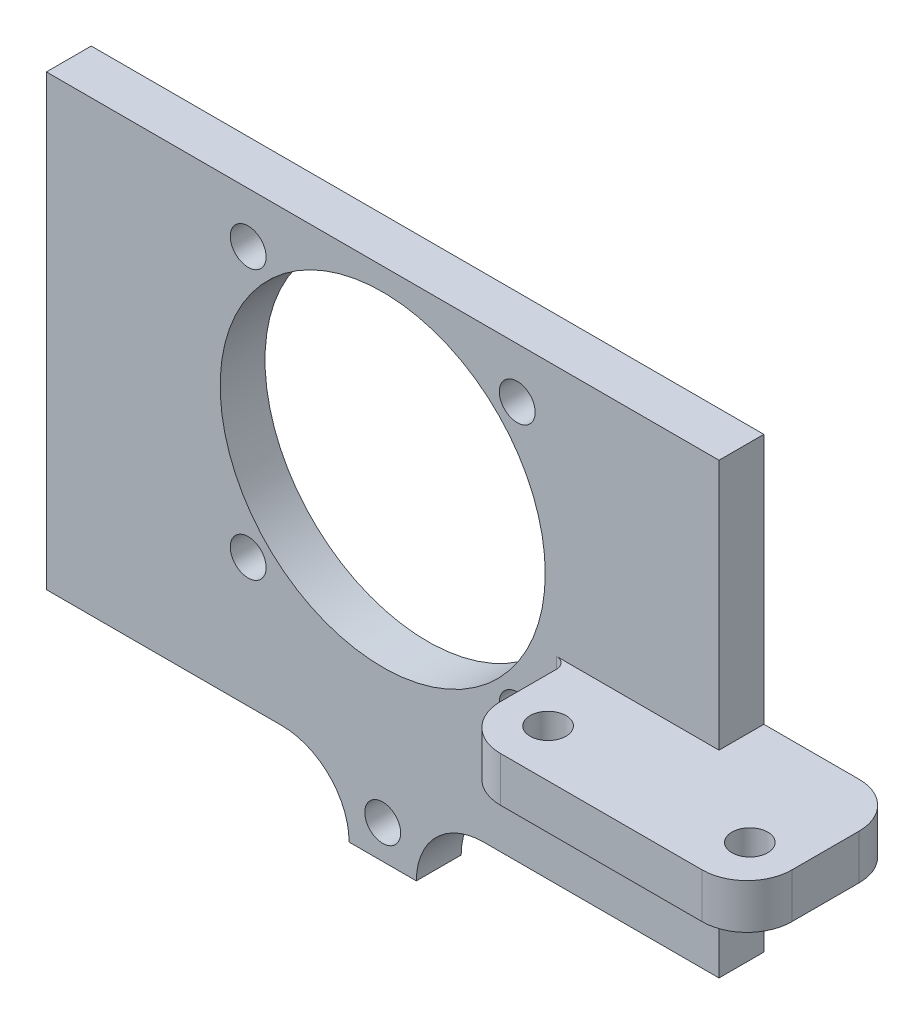
ISO-10303-21;
HEADER;
FILE_DESCRIPTION(('STEP AP214'),'2;1');
FILE_NAME('part.step','',(''),(''),'','','');
FILE_SCHEMA(('AUTOMOTIVE_DESIGN { 1 0 10303 214 1 1 1 1 }'));
ENDSEC;
DATA;
#1=APPLICATION_CONTEXT('core data for automotive mechanical design processes');
#2=APPLICATION_PROTOCOL_DEFINITION('international standard','automotive_design',2000,#1);
#3=PRODUCT_CONTEXT('',#1,'mechanical');
#4=PRODUCT('Part','Part','',(#3));
#5=PRODUCT_RELATED_PRODUCT_CATEGORY('part','',(#4));
#6=PRODUCT_DEFINITION_FORMATION('','',#4);
#7=PRODUCT_DEFINITION_CONTEXT('part definition',#1,'design');
#8=PRODUCT_DEFINITION('design','',#6,#7);
#9=PRODUCT_DEFINITION_SHAPE('','',#8);
#10=(LENGTH_UNIT() NAMED_UNIT(*) SI_UNIT(.MILLI.,.METRE.));
#11=(NAMED_UNIT(*) PLANE_ANGLE_UNIT() SI_UNIT($,.RADIAN.));
#12=(NAMED_UNIT(*) SI_UNIT($,.STERADIAN.) SOLID_ANGLE_UNIT());
#13=UNCERTAINTY_MEASURE_WITH_UNIT(LENGTH_MEASURE(1.E-05),#10,'distance_accuracy_value','');
#14=(GEOMETRIC_REPRESENTATION_CONTEXT(3) GLOBAL_UNCERTAINTY_ASSIGNED_CONTEXT((#13)) GLOBAL_UNIT_ASSIGNED_CONTEXT((#10,
#11,#12)) REPRESENTATION_CONTEXT('',''));
#15=CARTESIAN_POINT('',(0.,0.,0.));
#16=DIRECTION('',(0.,0.,1.));
#17=DIRECTION('',(1.,0.,0.));
#18=AXIS2_PLACEMENT_3D('',#15,#16,#17);
#19=CARTESIAN_POINT('',(0.,0.,4.));
#20=DIRECTION('',(0.,1.,0.));
#21=DIRECTION('',(0.,0.,1.));
#22=AXIS2_PLACEMENT_3D('',#19,#20,#21);
#23=PLANE('',#22);
#24=DIRECTION('',(1.,0.,0.));
#25=VECTOR('',#24,1.);
#26=CARTESIAN_POINT('',(0.,0.,4.));
#27=LINE('',#26,#25);
#28=CARTESIAN_POINT('',(39.,0.,4.));
#29=VERTEX_POINT('',#28);
#30=CARTESIAN_POINT('',(60.,0.,4.));
#31=VERTEX_POINT('',#30);
#32=EDGE_CURVE('E268',#29,#31,#27,.T.);
#33=ORIENTED_EDGE('',*,*,#32,.F.);
#34=DIRECTION('',(0.,0.,1.));
#35=VECTOR('',#34,1.);
#36=CARTESIAN_POINT('',(39.,0.,0.));
#37=LINE('',#36,#35);
#38=CARTESIAN_POINT('',(39.,0.,0.));
#39=VERTEX_POINT('',#38);
#40=EDGE_CURVE('E56',#29,#39,#37,.F.);
#41=ORIENTED_EDGE('',*,*,#40,.T.);
#42=DIRECTION('',(1.,0.,0.));
#43=VECTOR('',#42,1.);
#44=CARTESIAN_POINT('',(0.,0.,0.));
#45=LINE('',#44,#43);
#46=CARTESIAN_POINT('',(60.,0.,0.));
#47=VERTEX_POINT('',#46);
#48=EDGE_CURVE('E280',#39,#47,#45,.T.);
#49=ORIENTED_EDGE('',*,*,#48,.T.);
#50=DIRECTION('',(0.,0.,-1.));
#51=VECTOR('',#50,1.);
#52=CARTESIAN_POINT('',(60.,0.,4.));
#53=LINE('',#52,#51);
#54=EDGE_CURVE('E294',#31,#47,#53,.T.);
#55=ORIENTED_EDGE('',*,*,#54,.F.);
#56=EDGE_LOOP('',(#33,#41,#49,#55));
#57=FACE_BOUND('',#56,.T.);
#58=ADVANCED_FACE('F35',(#57),#23,.F.);
#59=CARTESIAN_POINT('',(0.,0.,0.));
#60=VERTEX_POINT('',#59);
#61=CARTESIAN_POINT('',(21.,0.,0.));
#62=VERTEX_POINT('',#61);
#63=EDGE_CURVE('E281',#60,#62,#45,.T.);
#64=ORIENTED_EDGE('',*,*,#63,.T.);
#65=DIRECTION('',(0.,0.,-1.));
#66=VECTOR('',#65,1.);
#67=CARTESIAN_POINT('',(21.,0.,4.));
#68=LINE('',#67,#66);
#69=CARTESIAN_POINT('',(21.,0.,4.));
#70=VERTEX_POINT('',#69);
#71=EDGE_CURVE('E343',#62,#70,#68,.F.);
#72=ORIENTED_EDGE('',*,*,#71,.T.);
#73=CARTESIAN_POINT('',(0.,0.,4.));
#74=VERTEX_POINT('',#73);
#75=EDGE_CURVE('E270',#74,#70,#27,.T.);
#76=ORIENTED_EDGE('',*,*,#75,.F.);
#77=DIRECTION('',(0.,0.,-1.));
#78=VECTOR('',#77,1.);
#79=CARTESIAN_POINT('',(0.,0.,4.));
#80=LINE('',#79,#78);
#81=EDGE_CURVE('E222',#74,#60,#80,.T.);
#82=ORIENTED_EDGE('',*,*,#81,.T.);
#83=EDGE_LOOP('',(#64,#72,#76,#82));
#84=FACE_BOUND('',#83,.T.);
#85=ADVANCED_FACE('F359',(#84),#23,.F.);
#86=CARTESIAN_POINT('',(60.,0.,4.));
#87=DIRECTION('',(-1.,0.,0.));
#88=DIRECTION('',(0.,0.,1.));
#89=AXIS2_PLACEMENT_3D('',#86,#87,#88);
#90=PLANE('',#89);
#91=DIRECTION('',(0.,1.,0.));
#92=VECTOR('',#91,1.);
#93=CARTESIAN_POINT('',(60.,0.,0.));
#94=LINE('',#93,#92);
#95=CARTESIAN_POINT('',(60.,12.5999999999763,0.));
#96=VERTEX_POINT('',#95);
#97=EDGE_CURVE('E285',#47,#96,#94,.T.);
#98=ORIENTED_EDGE('',*,*,#97,.T.);
#99=DIRECTION('',(0.,0.,-1.));
#100=VECTOR('',#99,1.);
#101=CARTESIAN_POINT('',(60.,12.5999999999763,4.));
#102=LINE('',#101,#100);
#103=CARTESIAN_POINT('',(60.,12.5999999999763,4.));
#104=VERTEX_POINT('',#103);
#105=EDGE_CURVE('E330',#96,#104,#102,.F.);
#106=ORIENTED_EDGE('',*,*,#105,.T.);
#107=DIRECTION('',(0.,1.,0.));
#108=VECTOR('',#107,1.);
#109=CARTESIAN_POINT('',(60.,0.,4.));
#110=LINE('',#109,#108);
#111=EDGE_CURVE('E273',#31,#104,#110,.T.);
#112=ORIENTED_EDGE('',*,*,#111,.F.);
#113=ORIENTED_EDGE('',*,*,#54,.T.);
#114=EDGE_LOOP('',(#98,#106,#112,#113));
#115=FACE_BOUND('',#114,.T.);
#116=ADVANCED_FACE('F376',(#115),#90,.F.);
#117=DIRECTION('',(0.,0.,1.));
#118=VECTOR('',#117,1.);
#119=CARTESIAN_POINT('',(60.,17.5999999999763,4.));
#120=LINE('',#119,#118);
#121=CARTESIAN_POINT('',(60.,17.5999999999763,0.));
#122=VERTEX_POINT('',#121);
#123=CARTESIAN_POINT('',(60.,17.5999999999763,4.));
#124=VERTEX_POINT('',#123);
#125=EDGE_CURVE('E192',#122,#124,#120,.T.);
#126=ORIENTED_EDGE('',*,*,#125,.F.);
#127=CARTESIAN_POINT('',(60.,40.,0.));
#128=VERTEX_POINT('',#127);
#129=EDGE_CURVE('E284',#122,#128,#94,.T.);
#130=ORIENTED_EDGE('',*,*,#129,.T.);
#131=DIRECTION('',(0.,0.,-1.));
#132=VECTOR('',#131,1.);
#133=CARTESIAN_POINT('',(60.,40.,4.));
#134=LINE('',#133,#132);
#135=CARTESIAN_POINT('',(60.,40.,4.));
#136=VERTEX_POINT('',#135);
#137=EDGE_CURVE('E291',#136,#128,#134,.T.);
#138=ORIENTED_EDGE('',*,*,#137,.F.);
#139=EDGE_CURVE('E272',#124,#136,#110,.T.);
#140=ORIENTED_EDGE('',*,*,#139,.F.);
#141=EDGE_LOOP('',(#126,#130,#138,#140));
#142=FACE_BOUND('',#141,.T.);
#143=ADVANCED_FACE('F443',(#142),#90,.F.);
#144=CARTESIAN_POINT('',(0.,0.,4.));
#145=DIRECTION('',(0.,0.,-1.));
#146=DIRECTION('',(-1.,0.,0.));
#147=AXIS2_PLACEMENT_3D('',#144,#145,#146);
#148=PLANE('',#147);
#149=CARTESIAN_POINT('',(30.,-3.,4.));
#150=DIRECTION('',(0.,0.,1.));
#151=DIRECTION('',(1.,0.,0.));
#152=AXIS2_PLACEMENT_3D('',#149,#150,#151);
#153=CIRCLE('',#152,1.6);
#154=CARTESIAN_POINT('',(31.6,-3.,4.));
#155=VERTEX_POINT('',#154);
#156=EDGE_CURVE('E185',#155,#155,#153,.T.);
#157=ORIENTED_EDGE('',*,*,#156,.F.);
#158=EDGE_LOOP('',(#157));
#159=FACE_BOUND('',#158,.T.);
#160=CARTESIAN_POINT('',(30.,23.5,4.));
#161=DIRECTION('',(0.,0.,1.));
#162=DIRECTION('',(1.,0.,0.));
#163=AXIS2_PLACEMENT_3D('',#160,#161,#162);
#164=CIRCLE('',#163,14.5);
#165=CARTESIAN_POINT('',(44.5,23.5,4.));
#166=VERTEX_POINT('',#165);
#167=EDGE_CURVE('E256',#166,#166,#164,.T.);
#168=ORIENTED_EDGE('',*,*,#167,.F.);
#169=EDGE_LOOP('',(#168));
#170=FACE_BOUND('',#169,.T.);
#171=CARTESIAN_POINT('',(42.0000000000001,11.4999999999967,4.));
#172=DIRECTION('',(0.,0.,1.));
#173=DIRECTION('',(1.,0.,0.));
#174=AXIS2_PLACEMENT_3D('',#171,#172,#173);
#175=CIRCLE('',#174,1.60000000000088);
#176=CARTESIAN_POINT('',(43.600000000001,11.4999999999967,4.));
#177=VERTEX_POINT('',#176);
#178=EDGE_CURVE('E238',#177,#177,#175,.T.);
#179=ORIENTED_EDGE('',*,*,#178,.F.);
#180=EDGE_LOOP('',(#179));
#181=FACE_BOUND('',#180,.T.);
#182=CARTESIAN_POINT('',(18.0000000000002,11.4999999999966,4.));
#183=DIRECTION('',(0.,0.,1.));
#184=DIRECTION('',(1.,0.,0.));
#185=AXIS2_PLACEMENT_3D('',#182,#183,#184);
#186=CIRCLE('',#185,1.60000000000088);
#187=CARTESIAN_POINT('',(19.6000000000011,11.4999999999966,4.));
#188=VERTEX_POINT('',#187);
#189=EDGE_CURVE('E239',#188,#188,#186,.T.);
#190=ORIENTED_EDGE('',*,*,#189,.F.);
#191=EDGE_LOOP('',(#190));
#192=FACE_BOUND('',#191,.T.);
#193=CARTESIAN_POINT('',(18.,35.4999999999966,4.));
#194=DIRECTION('',(0.,0.,1.));
#195=DIRECTION('',(1.,0.,0.));
#196=AXIS2_PLACEMENT_3D('',#193,#194,#195);
#197=CIRCLE('',#196,1.60000000000088);
#198=CARTESIAN_POINT('',(19.6000000000009,35.4999999999966,4.));
#199=VERTEX_POINT('',#198);
#200=EDGE_CURVE('E245',#199,#199,#197,.T.);
#201=ORIENTED_EDGE('',*,*,#200,.F.);
#202=EDGE_LOOP('',(#201));
#203=FACE_BOUND('',#202,.T.);
#204=CARTESIAN_POINT('',(42.0000000000001,35.4999999999967,4.));
#205=DIRECTION('',(0.,0.,1.));
#206=DIRECTION('',(1.,0.,0.));
#207=AXIS2_PLACEMENT_3D('',#204,#205,#206);
#208=CIRCLE('',#207,1.60000000000088);
#209=CARTESIAN_POINT('',(43.6000000000009,35.4999999999967,4.));
#210=VERTEX_POINT('',#209);
#211=EDGE_CURVE('E234',#210,#210,#208,.T.);
#212=ORIENTED_EDGE('',*,*,#211,.F.);
#213=EDGE_LOOP('',(#212));
#214=FACE_BOUND('',#213,.T.);
#215=ORIENTED_EDGE('',*,*,#111,.T.);
#216=DIRECTION('',(1.,0.,0.));
#217=VECTOR('',#216,1.);
#218=CARTESIAN_POINT('',(46.5000000000019,12.5999999999763,4.));
#219=LINE('',#218,#217);
#220=CARTESIAN_POINT('',(45.5000000000019,12.5999999999763,4.));
#221=VERTEX_POINT('',#220);
#222=EDGE_CURVE('E335',#104,#221,#219,.F.);
#223=ORIENTED_EDGE('',*,*,#222,.T.);
#224=DIRECTION('',(0.,-1.,0.));
#225=VECTOR('',#224,1.);
#226=CARTESIAN_POINT('',(45.5000000000019,17.5999999999763,4.));
#227=LINE('',#226,#225);
#228=CARTESIAN_POINT('',(45.5000000000019,17.5999999999763,4.));
#229=VERTEX_POINT('',#228);
#230=EDGE_CURVE('E332',#221,#229,#227,.F.);
#231=ORIENTED_EDGE('',*,*,#230,.T.);
#232=DIRECTION('',(-1.,0.,0.));
#233=VECTOR('',#232,1.);
#234=CARTESIAN_POINT('',(46.5000000000019,17.5999999999763,4.));
#235=LINE('',#234,#233);
#236=EDGE_CURVE('E219',#124,#229,#235,.T.);
#237=ORIENTED_EDGE('',*,*,#236,.F.);
#238=ORIENTED_EDGE('',*,*,#139,.T.);
#239=DIRECTION('',(-1.,0.,0.));
#240=VECTOR('',#239,1.);
#241=CARTESIAN_POINT('',(0.,40.,4.));
#242=LINE('',#241,#240);
#243=CARTESIAN_POINT('',(0.,40.,4.));
#244=VERTEX_POINT('',#243);
#245=EDGE_CURVE('E275',#136,#244,#242,.T.);
#246=ORIENTED_EDGE('',*,*,#245,.T.);
#247=DIRECTION('',(0.,-1.,0.));
#248=VECTOR('',#247,1.);
#249=CARTESIAN_POINT('',(0.,0.,4.));
#250=LINE('',#249,#248);
#251=EDGE_CURVE('E265',#244,#74,#250,.T.);
#252=ORIENTED_EDGE('',*,*,#251,.T.);
#253=ORIENTED_EDGE('',*,*,#75,.T.);
#254=CARTESIAN_POINT('',(21.,-6.,4.));
#255=DIRECTION('',(0.,0.,-1.));
#256=DIRECTION('',(-1.,0.,0.));
#257=AXIS2_PLACEMENT_3D('',#254,#255,#256);
#258=CIRCLE('',#257,6.);
#259=CARTESIAN_POINT('',(27.,-6.,4.));
#260=VERTEX_POINT('',#259);
#261=EDGE_CURVE('E166',#70,#260,#258,.T.);
#262=ORIENTED_EDGE('',*,*,#261,.T.);
#263=DIRECTION('',(-1.,0.,0.));
#264=VECTOR('',#263,1.);
#265=CARTESIAN_POINT('',(33.,-6.,4.));
#266=LINE('',#265,#264);
#267=CARTESIAN_POINT('',(33.,-6.,4.));
#268=VERTEX_POINT('',#267);
#269=EDGE_CURVE('E168',#268,#260,#266,.T.);
#270=ORIENTED_EDGE('',*,*,#269,.F.);
#271=CARTESIAN_POINT('',(39.,-6.,4.));
#272=DIRECTION('',(0.,0.,-1.));
#273=DIRECTION('',(-1.,0.,0.));
#274=AXIS2_PLACEMENT_3D('',#271,#272,#273);
#275=CIRCLE('',#274,6.);
#276=EDGE_CURVE('E43',#268,#29,#275,.T.);
#277=ORIENTED_EDGE('',*,*,#276,.T.);
#278=ORIENTED_EDGE('',*,*,#32,.T.);
#279=EDGE_LOOP('',(#215,#223,#231,#237,#238,#246,#252,#253,#262,#270,#277,#278));
#280=FACE_BOUND('',#279,.T.);
#281=ADVANCED_FACE('F170',(#159,#170,#181,#192,#203,#214,#280),#148,.F.);
#282=CARTESIAN_POINT('',(0.,0.,4.));
#283=DIRECTION('',(1.,0.,0.));
#284=DIRECTION('',(0.,0.,-1.));
#285=AXIS2_PLACEMENT_3D('',#282,#283,#284);
#286=PLANE('',#285);
#287=DIRECTION('',(0.,-1.,0.));
#288=VECTOR('',#287,1.);
#289=CARTESIAN_POINT('',(0.,0.,0.));
#290=LINE('',#289,#288);
#291=CARTESIAN_POINT('',(0.,40.,0.));
#292=VERTEX_POINT('',#291);
#293=EDGE_CURVE('E262',#292,#60,#290,.T.);
#294=ORIENTED_EDGE('',*,*,#293,.T.);
#295=ORIENTED_EDGE('',*,*,#81,.F.);
#296=ORIENTED_EDGE('',*,*,#251,.F.);
#297=DIRECTION('',(0.,0.,-1.));
#298=VECTOR('',#297,1.);
#299=CARTESIAN_POINT('',(0.,40.,4.));
#300=LINE('',#299,#298);
#301=EDGE_CURVE('E277',#244,#292,#300,.T.);
#302=ORIENTED_EDGE('',*,*,#301,.T.);
#303=EDGE_LOOP('',(#294,#295,#296,#302));
#304=FACE_BOUND('',#303,.T.);
#305=ADVANCED_FACE('F380',(#304),#286,.F.);
#306=CARTESIAN_POINT('',(0.,40.,4.));
#307=DIRECTION('',(0.,-1.,0.));
#308=DIRECTION('',(0.,0.,-1.));
#309=AXIS2_PLACEMENT_3D('',#306,#307,#308);
#310=PLANE('',#309);
#311=DIRECTION('',(-1.,0.,0.));
#312=VECTOR('',#311,1.);
#313=CARTESIAN_POINT('',(0.,40.,0.));
#314=LINE('',#313,#312);
#315=EDGE_CURVE('E269',#128,#292,#314,.T.);
#316=ORIENTED_EDGE('',*,*,#315,.T.);
#317=ORIENTED_EDGE('',*,*,#301,.F.);
#318=ORIENTED_EDGE('',*,*,#245,.F.);
#319=ORIENTED_EDGE('',*,*,#137,.T.);
#320=EDGE_LOOP('',(#316,#317,#318,#319));
#321=FACE_BOUND('',#320,.T.);
#322=ADVANCED_FACE('F383',(#321),#310,.F.);
#323=CARTESIAN_POINT('',(0.,0.,0.));
#324=DIRECTION('',(0.,0.,-1.));
#325=DIRECTION('',(-1.,0.,0.));
#326=AXIS2_PLACEMENT_3D('',#323,#324,#325);
#327=PLANE('',#326);
#328=CARTESIAN_POINT('',(30.,-3.,0.));
#329=DIRECTION('',(0.,0.,-1.));
#330=DIRECTION('',(-1.,0.,0.));
#331=AXIS2_PLACEMENT_3D('',#328,#329,#330);
#332=CIRCLE('',#331,1.6);
#333=CARTESIAN_POINT('',(28.4,-3.,0.));
#334=VERTEX_POINT('',#333);
#335=EDGE_CURVE('E182',#334,#334,#332,.T.);
#336=ORIENTED_EDGE('',*,*,#335,.F.);
#337=EDGE_LOOP('',(#336));
#338=FACE_BOUND('',#337,.T.);
#339=CARTESIAN_POINT('',(42.0000000000001,35.4999999999967,0.));
#340=DIRECTION('',(0.,0.,1.));
#341=DIRECTION('',(1.,0.,0.));
#342=AXIS2_PLACEMENT_3D('',#339,#340,#341);
#343=CIRCLE('',#342,1.60000000000088);
#344=CARTESIAN_POINT('',(43.6000000000009,35.4999999999967,0.));
#345=VERTEX_POINT('',#344);
#346=EDGE_CURVE('E248',#345,#345,#343,.T.);
#347=ORIENTED_EDGE('',*,*,#346,.T.);
#348=EDGE_LOOP('',(#347));
#349=FACE_BOUND('',#348,.T.);
#350=CARTESIAN_POINT('',(18.,35.4999999999966,0.));
#351=DIRECTION('',(0.,0.,1.));
#352=DIRECTION('',(1.,0.,0.));
#353=AXIS2_PLACEMENT_3D('',#350,#351,#352);
#354=CIRCLE('',#353,1.60000000000088);
#355=CARTESIAN_POINT('',(19.6000000000009,35.4999999999966,0.));
#356=VERTEX_POINT('',#355);
#357=EDGE_CURVE('E242',#356,#356,#354,.T.);
#358=ORIENTED_EDGE('',*,*,#357,.T.);
#359=EDGE_LOOP('',(#358));
#360=FACE_BOUND('',#359,.T.);
#361=CARTESIAN_POINT('',(18.0000000000002,11.4999999999966,0.));
#362=DIRECTION('',(0.,0.,1.));
#363=DIRECTION('',(1.,0.,0.));
#364=AXIS2_PLACEMENT_3D('',#361,#362,#363);
#365=CIRCLE('',#364,1.60000000000088);
#366=CARTESIAN_POINT('',(19.6000000000011,11.4999999999966,0.));
#367=VERTEX_POINT('',#366);
#368=EDGE_CURVE('E235',#367,#367,#365,.T.);
#369=ORIENTED_EDGE('',*,*,#368,.T.);
#370=EDGE_LOOP('',(#369));
#371=FACE_BOUND('',#370,.T.);
#372=CARTESIAN_POINT('',(42.0000000000001,11.4999999999967,0.));
#373=DIRECTION('',(0.,0.,1.));
#374=DIRECTION('',(1.,0.,0.));
#375=AXIS2_PLACEMENT_3D('',#372,#373,#374);
#376=CIRCLE('',#375,1.60000000000088);
#377=CARTESIAN_POINT('',(43.600000000001,11.4999999999967,0.));
#378=VERTEX_POINT('',#377);
#379=EDGE_CURVE('E253',#378,#378,#376,.T.);
#380=ORIENTED_EDGE('',*,*,#379,.T.);
#381=EDGE_LOOP('',(#380));
#382=FACE_BOUND('',#381,.T.);
#383=CARTESIAN_POINT('',(30.,23.5,0.));
#384=DIRECTION('',(0.,0.,1.));
#385=DIRECTION('',(1.,0.,0.));
#386=AXIS2_PLACEMENT_3D('',#383,#384,#385);
#387=CIRCLE('',#386,14.5);
#388=CARTESIAN_POINT('',(44.5,23.5,0.));
#389=VERTEX_POINT('',#388);
#390=EDGE_CURVE('E259',#389,#389,#387,.T.);
#391=ORIENTED_EDGE('',*,*,#390,.T.);
#392=EDGE_LOOP('',(#391));
#393=FACE_BOUND('',#392,.T.);
#394=DIRECTION('',(-1.,0.,0.));
#395=VECTOR('',#394,1.);
#396=CARTESIAN_POINT('',(72.5,17.5999999999763,0.));
#397=LINE('',#396,#395);
#398=CARTESIAN_POINT('',(68.5000000000019,17.5999999999763,0.));
#399=VERTEX_POINT('',#398);
#400=EDGE_CURVE('E194',#399,#122,#397,.T.);
#401=ORIENTED_EDGE('',*,*,#400,.F.);
#402=DIRECTION('',(0.,1.,0.));
#403=VECTOR('',#402,1.);
#404=CARTESIAN_POINT('',(68.5000000000019,13.5999999999763,0.));
#405=LINE('',#404,#403);
#406=CARTESIAN_POINT('',(68.5000000000019,13.5999999999763,0.));
#407=VERTEX_POINT('',#406);
#408=EDGE_CURVE('E309',#399,#407,#405,.F.);
#409=ORIENTED_EDGE('',*,*,#408,.T.);
#410=DIRECTION('',(-1.,0.,0.));
#411=VECTOR('',#410,1.);
#412=CARTESIAN_POINT('',(72.5,13.5999999999763,0.));
#413=LINE('',#412,#411);
#414=CARTESIAN_POINT('',(61.,13.5999999999763,0.));
#415=VERTEX_POINT('',#414);
#416=EDGE_CURVE('E197',#407,#415,#413,.T.);
#417=ORIENTED_EDGE('',*,*,#416,.T.);
#418=CARTESIAN_POINT('',(61.,12.5999999999763,0.));
#419=DIRECTION('',(0.,0.,-1.));
#420=DIRECTION('',(-1.,0.,0.));
#421=AXIS2_PLACEMENT_3D('',#418,#419,#420);
#422=CIRCLE('',#421,1.);
#423=EDGE_CURVE('E339',#415,#96,#422,.F.);
#424=ORIENTED_EDGE('',*,*,#423,.T.);
#425=ORIENTED_EDGE('',*,*,#97,.F.);
#426=ORIENTED_EDGE('',*,*,#48,.F.);
#427=CARTESIAN_POINT('',(39.,-6.,0.));
#428=DIRECTION('',(0.,0.,-1.));
#429=DIRECTION('',(-1.,0.,0.));
#430=AXIS2_PLACEMENT_3D('',#427,#428,#429);
#431=CIRCLE('',#430,6.);
#432=CARTESIAN_POINT('',(33.,-6.,0.));
#433=VERTEX_POINT('',#432);
#434=EDGE_CURVE('E11',#39,#433,#431,.F.);
#435=ORIENTED_EDGE('',*,*,#434,.T.);
#436=DIRECTION('',(1.,0.,0.));
#437=VECTOR('',#436,1.);
#438=CARTESIAN_POINT('',(33.,-6.,0.));
#439=LINE('',#438,#437);
#440=CARTESIAN_POINT('',(27.,-6.,0.));
#441=VERTEX_POINT('',#440);
#442=EDGE_CURVE('E181',#441,#433,#439,.T.);
#443=ORIENTED_EDGE('',*,*,#442,.F.);
#444=CARTESIAN_POINT('',(21.,-6.,0.));
#445=DIRECTION('',(0.,0.,-1.));
#446=DIRECTION('',(-1.,0.,0.));
#447=AXIS2_PLACEMENT_3D('',#444,#445,#446);
#448=CIRCLE('',#447,6.);
#449=EDGE_CURVE('E350',#441,#62,#448,.F.);
#450=ORIENTED_EDGE('',*,*,#449,.T.);
#451=ORIENTED_EDGE('',*,*,#63,.F.);
#452=ORIENTED_EDGE('',*,*,#293,.F.);
#453=ORIENTED_EDGE('',*,*,#315,.F.);
#454=ORIENTED_EDGE('',*,*,#129,.F.);
#455=EDGE_LOOP('',(#401,#409,#417,#424,#425,#426,#435,#443,#450,#451,#452,#453,#454));
#456=FACE_BOUND('',#455,.T.);
#457=ADVANCED_FACE('F354',(#338,#349,#360,#371,#382,#393,#456),#327,.T.);
#458=CARTESIAN_POINT('',(30.,23.5,0.));
#459=DIRECTION('',(0.,0.,1.));
#460=DIRECTION('',(1.,0.,0.));
#461=AXIS2_PLACEMENT_3D('',#458,#459,#460);
#462=CYLINDRICAL_SURFACE('',#461,14.5);
#463=ORIENTED_EDGE('',*,*,#390,.F.);
#464=EDGE_LOOP('',(#463));
#465=FACE_BOUND('',#464,.T.);
#466=ORIENTED_EDGE('',*,*,#167,.T.);
#467=EDGE_LOOP('',(#466));
#468=FACE_BOUND('',#467,.T.);
#469=ADVANCED_FACE('F475',(#465,#468),#462,.F.);
#470=CARTESIAN_POINT('',(42.0000000000001,11.4999999999967,0.));
#471=DIRECTION('',(0.,0.,1.));
#472=DIRECTION('',(1.,0.,0.));
#473=AXIS2_PLACEMENT_3D('',#470,#471,#472);
#474=CYLINDRICAL_SURFACE('',#473,1.60000000000088);
#475=ORIENTED_EDGE('',*,*,#379,.F.);
#476=EDGE_LOOP('',(#475));
#477=FACE_BOUND('',#476,.T.);
#478=ORIENTED_EDGE('',*,*,#178,.T.);
#479=EDGE_LOOP('',(#478));
#480=FACE_BOUND('',#479,.T.);
#481=ADVANCED_FACE('F495',(#477,#480),#474,.F.);
#482=CARTESIAN_POINT('',(18.0000000000002,11.4999999999966,0.));
#483=DIRECTION('',(0.,0.,1.));
#484=DIRECTION('',(1.,0.,0.));
#485=AXIS2_PLACEMENT_3D('',#482,#483,#484);
#486=CYLINDRICAL_SURFACE('',#485,1.60000000000088);
#487=ORIENTED_EDGE('',*,*,#368,.F.);
#488=EDGE_LOOP('',(#487));
#489=FACE_BOUND('',#488,.T.);
#490=ORIENTED_EDGE('',*,*,#189,.T.);
#491=EDGE_LOOP('',(#490));
#492=FACE_BOUND('',#491,.T.);
#493=ADVANCED_FACE('F502',(#489,#492),#486,.F.);
#494=CARTESIAN_POINT('',(18.,35.4999999999966,0.));
#495=DIRECTION('',(0.,0.,1.));
#496=DIRECTION('',(1.,0.,0.));
#497=AXIS2_PLACEMENT_3D('',#494,#495,#496);
#498=CYLINDRICAL_SURFACE('',#497,1.60000000000088);
#499=ORIENTED_EDGE('',*,*,#357,.F.);
#500=EDGE_LOOP('',(#499));
#501=FACE_BOUND('',#500,.T.);
#502=ORIENTED_EDGE('',*,*,#200,.T.);
#503=EDGE_LOOP('',(#502));
#504=FACE_BOUND('',#503,.T.);
#505=ADVANCED_FACE('F509',(#501,#504),#498,.F.);
#506=CARTESIAN_POINT('',(42.0000000000001,35.4999999999967,0.));
#507=DIRECTION('',(0.,0.,1.));
#508=DIRECTION('',(1.,0.,0.));
#509=AXIS2_PLACEMENT_3D('',#506,#507,#508);
#510=CYLINDRICAL_SURFACE('',#509,1.60000000000088);
#511=ORIENTED_EDGE('',*,*,#346,.F.);
#512=EDGE_LOOP('',(#511));
#513=FACE_BOUND('',#512,.T.);
#514=ORIENTED_EDGE('',*,*,#211,.T.);
#515=EDGE_LOOP('',(#514));
#516=FACE_BOUND('',#515,.T.);
#517=ADVANCED_FACE('F517',(#513,#516),#510,.F.);
#518=CARTESIAN_POINT('',(46.5000000000019,17.5999999999763,14.));
#519=DIRECTION('',(1.,0.,0.));
#520=DIRECTION('',(0.,0.,-1.));
#521=AXIS2_PLACEMENT_3D('',#518,#519,#520);
#522=PLANE('',#521);
#523=DIRECTION('',(0.,0.,-1.));
#524=VECTOR('',#523,1.);
#525=CARTESIAN_POINT('',(46.5000000000019,17.5999999999763,14.));
#526=LINE('',#525,#524);
#527=CARTESIAN_POINT('',(46.5000000000019,17.5999999999763,10.));
#528=VERTEX_POINT('',#527);
#529=CARTESIAN_POINT('',(46.5000000000019,17.5999999999763,5.));
#530=VERTEX_POINT('',#529);
#531=EDGE_CURVE('E218',#528,#530,#526,.T.);
#532=ORIENTED_EDGE('',*,*,#531,.T.);
#533=DIRECTION('',(0.,-1.,0.));
#534=VECTOR('',#533,1.);
#535=CARTESIAN_POINT('',(46.5000000000019,13.5999999999763,5.));
#536=LINE('',#535,#534);
#537=CARTESIAN_POINT('',(46.5000000000019,13.5999999999763,5.));
#538=VERTEX_POINT('',#537);
#539=EDGE_CURVE('E337',#530,#538,#536,.T.);
#540=ORIENTED_EDGE('',*,*,#539,.T.);
#541=DIRECTION('',(0.,0.,-1.));
#542=VECTOR('',#541,1.);
#543=CARTESIAN_POINT('',(46.5000000000019,13.5999999999763,14.));
#544=LINE('',#543,#542);
#545=CARTESIAN_POINT('',(46.5000000000019,13.5999999999763,10.));
#546=VERTEX_POINT('',#545);
#547=EDGE_CURVE('E231',#546,#538,#544,.T.);
#548=ORIENTED_EDGE('',*,*,#547,.F.);
#549=DIRECTION('',(0.,-1.,0.));
#550=VECTOR('',#549,1.);
#551=CARTESIAN_POINT('',(46.5000000000019,17.5999999999763,10.));
#552=LINE('',#551,#550);
#553=EDGE_CURVE('E323',#546,#528,#552,.F.);
#554=ORIENTED_EDGE('',*,*,#553,.T.);
#555=EDGE_LOOP('',(#532,#540,#548,#554));
#556=FACE_BOUND('',#555,.T.);
#557=ADVANCED_FACE('F419',(#556),#522,.F.);
#558=CARTESIAN_POINT('',(46.5000000000019,13.5999999999763,14.));
#559=DIRECTION('',(0.,1.,0.));
#560=DIRECTION('',(-1.,0.,0.));
#561=AXIS2_PLACEMENT_3D('',#558,#559,#560);
#562=PLANE('',#561);
#563=CARTESIAN_POINT('',(68.5000000000007,13.5999999999763,9.74999999999541));
#564=DIRECTION('',(0.,1.,0.));
#565=DIRECTION('',(-1.,0.,0.));
#566=AXIS2_PLACEMENT_3D('',#563,#564,#565);
#567=CIRCLE('',#566,1.59999999999823);
#568=CARTESIAN_POINT('',(66.9000000000024,13.5999999999763,9.74999999999541));
#569=VERTEX_POINT('',#568);
#570=EDGE_CURVE('E209',#569,#569,#567,.T.);
#571=ORIENTED_EDGE('',*,*,#570,.T.);
#572=EDGE_LOOP('',(#571));
#573=FACE_BOUND('',#572,.T.);
#574=CARTESIAN_POINT('',(50.5000000000007,13.5999999999763,9.74999999999541));
#575=DIRECTION('',(0.,1.,0.));
#576=DIRECTION('',(-1.,0.,0.));
#577=AXIS2_PLACEMENT_3D('',#574,#575,#576);
#578=CIRCLE('',#577,1.59999999999822);
#579=CARTESIAN_POINT('',(48.9000000000024,13.5999999999763,9.74999999999541));
#580=VERTEX_POINT('',#579);
#581=EDGE_CURVE('E204',#580,#580,#578,.T.);
#582=ORIENTED_EDGE('',*,*,#581,.T.);
#583=EDGE_LOOP('',(#582));
#584=FACE_BOUND('',#583,.T.);
#585=DIRECTION('',(1.,0.,0.));
#586=VECTOR('',#585,1.);
#587=CARTESIAN_POINT('',(60.,13.5999999999763,5.));
#588=LINE('',#587,#586);
#589=CARTESIAN_POINT('',(61.,13.5999999999763,5.));
#590=VERTEX_POINT('',#589);
#591=EDGE_CURVE('E325',#538,#590,#588,.T.);
#592=ORIENTED_EDGE('',*,*,#591,.T.);
#593=DIRECTION('',(0.,0.,-1.));
#594=VECTOR('',#593,1.);
#595=CARTESIAN_POINT('',(61.,13.5999999999763,0.));
#596=LINE('',#595,#594);
#597=EDGE_CURVE('E327',#590,#415,#596,.T.);
#598=ORIENTED_EDGE('',*,*,#597,.T.);
#599=ORIENTED_EDGE('',*,*,#416,.F.);
#600=CARTESIAN_POINT('',(68.5000000000019,13.5999999999763,4.));
#601=DIRECTION('',(0.,1.,0.));
#602=DIRECTION('',(-1.,0.,0.));
#603=AXIS2_PLACEMENT_3D('',#600,#601,#602);
#604=CIRCLE('',#603,4.);
#605=CARTESIAN_POINT('',(72.5000000000019,13.5999999999763,4.));
#606=VERTEX_POINT('',#605);
#607=EDGE_CURVE('E315',#407,#606,#604,.F.);
#608=ORIENTED_EDGE('',*,*,#607,.T.);
#609=DIRECTION('',(0.,0.,-1.));
#610=VECTOR('',#609,1.);
#611=CARTESIAN_POINT('',(72.5000000000019,13.5999999999763,14.));
#612=LINE('',#611,#610);
#613=CARTESIAN_POINT('',(72.5000000000019,13.5999999999763,10.));
#614=VERTEX_POINT('',#613);
#615=EDGE_CURVE('E228',#614,#606,#612,.T.);
#616=ORIENTED_EDGE('',*,*,#615,.F.);
#617=CARTESIAN_POINT('',(68.5000000000019,13.5999999999763,10.));
#618=DIRECTION('',(0.,1.,0.));
#619=DIRECTION('',(-1.,0.,0.));
#620=AXIS2_PLACEMENT_3D('',#617,#618,#619);
#621=CIRCLE('',#620,4.);
#622=CARTESIAN_POINT('',(68.5000000000019,13.5999999999763,14.));
#623=VERTEX_POINT('',#622);
#624=EDGE_CURVE('E313',#614,#623,#621,.F.);
#625=ORIENTED_EDGE('',*,*,#624,.T.);
#626=DIRECTION('',(1.,0.,0.));
#627=VECTOR('',#626,1.);
#628=CARTESIAN_POINT('',(46.5000000000019,13.5999999999763,14.));
#629=LINE('',#628,#627);
#630=CARTESIAN_POINT('',(50.5000000000019,13.5999999999763,14.));
#631=VERTEX_POINT('',#630);
#632=EDGE_CURVE('E212',#631,#623,#629,.T.);
#633=ORIENTED_EDGE('',*,*,#632,.F.);
#634=CARTESIAN_POINT('',(50.5000000000019,13.5999999999763,10.));
#635=DIRECTION('',(0.,1.,0.));
#636=DIRECTION('',(-1.,0.,0.));
#637=AXIS2_PLACEMENT_3D('',#634,#635,#636);
#638=CIRCLE('',#637,4.);
#639=EDGE_CURVE('E311',#631,#546,#638,.F.);
#640=ORIENTED_EDGE('',*,*,#639,.T.);
#641=ORIENTED_EDGE('',*,*,#547,.T.);
#642=EDGE_LOOP('',(#592,#598,#599,#608,#616,#625,#633,#640,#641));
#643=FACE_BOUND('',#642,.T.);
#644=ADVANCED_FACE('F456',(#573,#584,#643),#562,.F.);
#645=CARTESIAN_POINT('',(72.5000000000019,17.5999999999763,14.));
#646=DIRECTION('',(-1.,0.,0.));
#647=DIRECTION('',(0.,0.,1.));
#648=AXIS2_PLACEMENT_3D('',#645,#646,#647);
#649=PLANE('',#648);
#650=ORIENTED_EDGE('',*,*,#615,.T.);
#651=DIRECTION('',(0.,1.,0.));
#652=VECTOR('',#651,1.);
#653=CARTESIAN_POINT('',(72.5000000000019,17.5999999999763,4.));
#654=LINE('',#653,#652);
#655=CARTESIAN_POINT('',(72.5000000000019,17.5999999999763,4.));
#656=VERTEX_POINT('',#655);
#657=EDGE_CURVE('E300',#606,#656,#654,.T.);
#658=ORIENTED_EDGE('',*,*,#657,.T.);
#659=DIRECTION('',(0.,0.,-1.));
#660=VECTOR('',#659,1.);
#661=CARTESIAN_POINT('',(72.5000000000019,17.5999999999763,14.));
#662=LINE('',#661,#660);
#663=CARTESIAN_POINT('',(72.5000000000019,17.5999999999763,10.));
#664=VERTEX_POINT('',#663);
#665=EDGE_CURVE('E225',#664,#656,#662,.T.);
#666=ORIENTED_EDGE('',*,*,#665,.F.);
#667=DIRECTION('',(0.,1.,0.));
#668=VECTOR('',#667,1.);
#669=CARTESIAN_POINT('',(72.5000000000019,13.5999999999763,10.));
#670=LINE('',#669,#668);
#671=EDGE_CURVE('E221',#664,#614,#670,.F.);
#672=ORIENTED_EDGE('',*,*,#671,.T.);
#673=EDGE_LOOP('',(#650,#658,#666,#672));
#674=FACE_BOUND('',#673,.T.);
#675=ADVANCED_FACE('F432',(#674),#649,.F.);
#676=CARTESIAN_POINT('',(46.5000000000019,17.5999999999763,14.));
#677=DIRECTION('',(0.,-1.,0.));
#678=DIRECTION('',(0.,0.,-1.));
#679=AXIS2_PLACEMENT_3D('',#676,#677,#678);
#680=PLANE('',#679);
#681=CARTESIAN_POINT('',(68.5000000000007,17.5999999999763,9.74999999999541));
#682=DIRECTION('',(0.,1.,0.));
#683=DIRECTION('',(0.,0.,1.));
#684=AXIS2_PLACEMENT_3D('',#681,#682,#683);
#685=CIRCLE('',#684,1.59999999999823);
#686=CARTESIAN_POINT('',(68.5000000000007,17.5999999999763,11.3499999999936));
#687=VERTEX_POINT('',#686);
#688=EDGE_CURVE('E201',#687,#687,#685,.T.);
#689=ORIENTED_EDGE('',*,*,#688,.F.);
#690=EDGE_LOOP('',(#689));
#691=FACE_BOUND('',#690,.T.);
#692=CARTESIAN_POINT('',(50.5000000000007,17.5999999999763,9.74999999999541));
#693=DIRECTION('',(0.,1.,0.));
#694=DIRECTION('',(0.,0.,1.));
#695=AXIS2_PLACEMENT_3D('',#692,#693,#694);
#696=CIRCLE('',#695,1.59999999999822);
#697=CARTESIAN_POINT('',(50.5000000000007,17.5999999999763,11.3499999999936));
#698=VERTEX_POINT('',#697);
#699=EDGE_CURVE('E200',#698,#698,#696,.T.);
#700=ORIENTED_EDGE('',*,*,#699,.F.);
#701=EDGE_LOOP('',(#700));
#702=FACE_BOUND('',#701,.T.);
#703=ORIENTED_EDGE('',*,*,#665,.T.);
#704=CARTESIAN_POINT('',(68.5000000000019,17.5999999999763,4.));
#705=DIRECTION('',(0.,-1.,0.));
#706=DIRECTION('',(0.,0.,-1.));
#707=AXIS2_PLACEMENT_3D('',#704,#705,#706);
#708=CIRCLE('',#707,4.);
#709=EDGE_CURVE('E307',#656,#399,#708,.F.);
#710=ORIENTED_EDGE('',*,*,#709,.T.);
#711=ORIENTED_EDGE('',*,*,#400,.T.);
#712=ORIENTED_EDGE('',*,*,#125,.T.);
#713=ORIENTED_EDGE('',*,*,#236,.T.);
#714=CARTESIAN_POINT('',(45.5000000000019,17.5999999999763,5.));
#715=DIRECTION('',(0.,-1.,0.));
#716=DIRECTION('',(0.,0.,-1.));
#717=AXIS2_PLACEMENT_3D('',#714,#715,#716);
#718=CIRCLE('',#717,1.);
#719=EDGE_CURVE('E341',#229,#530,#718,.T.);
#720=ORIENTED_EDGE('',*,*,#719,.T.);
#721=ORIENTED_EDGE('',*,*,#531,.F.);
#722=CARTESIAN_POINT('',(50.5000000000019,17.5999999999763,10.));
#723=DIRECTION('',(0.,-1.,0.));
#724=DIRECTION('',(0.,0.,-1.));
#725=AXIS2_PLACEMENT_3D('',#722,#723,#724);
#726=CIRCLE('',#725,4.);
#727=CARTESIAN_POINT('',(50.5000000000019,17.5999999999763,14.));
#728=VERTEX_POINT('',#727);
#729=EDGE_CURVE('E303',#528,#728,#726,.F.);
#730=ORIENTED_EDGE('',*,*,#729,.T.);
#731=DIRECTION('',(-1.,0.,0.));
#732=VECTOR('',#731,1.);
#733=CARTESIAN_POINT('',(46.5000000000019,17.5999999999763,14.));
#734=LINE('',#733,#732);
#735=CARTESIAN_POINT('',(68.5000000000019,17.5999999999763,14.));
#736=VERTEX_POINT('',#735);
#737=EDGE_CURVE('E215',#736,#728,#734,.T.);
#738=ORIENTED_EDGE('',*,*,#737,.F.);
#739=CARTESIAN_POINT('',(68.5000000000019,17.5999999999763,10.));
#740=DIRECTION('',(0.,-1.,0.));
#741=DIRECTION('',(0.,0.,-1.));
#742=AXIS2_PLACEMENT_3D('',#739,#740,#741);
#743=CIRCLE('',#742,4.);
#744=EDGE_CURVE('E305',#736,#664,#743,.F.);
#745=ORIENTED_EDGE('',*,*,#744,.T.);
#746=EDGE_LOOP('',(#703,#710,#711,#712,#713,#720,#721,#730,#738,#745));
#747=FACE_BOUND('',#746,.T.);
#748=ADVANCED_FACE('F415',(#691,#702,#747),#680,.F.);
#749=CARTESIAN_POINT('',(0.,0.,14.));
#750=DIRECTION('',(0.,0.,1.));
#751=DIRECTION('',(1.,0.,0.));
#752=AXIS2_PLACEMENT_3D('',#749,#750,#751);
#753=PLANE('',#752);
#754=ORIENTED_EDGE('',*,*,#632,.T.);
#755=DIRECTION('',(0.,1.,0.));
#756=VECTOR('',#755,1.);
#757=CARTESIAN_POINT('',(68.5000000000019,17.5999999999763,14.));
#758=LINE('',#757,#756);
#759=EDGE_CURVE('E320',#623,#736,#758,.T.);
#760=ORIENTED_EDGE('',*,*,#759,.T.);
#761=ORIENTED_EDGE('',*,*,#737,.T.);
#762=DIRECTION('',(0.,-1.,0.));
#763=VECTOR('',#762,1.);
#764=CARTESIAN_POINT('',(50.5000000000019,13.5999999999763,14.));
#765=LINE('',#764,#763);
#766=EDGE_CURVE('E317',#728,#631,#765,.T.);
#767=ORIENTED_EDGE('',*,*,#766,.T.);
#768=EDGE_LOOP('',(#754,#760,#761,#767));
#769=FACE_BOUND('',#768,.T.);
#770=ADVANCED_FACE('F425',(#769),#753,.T.);
#771=CARTESIAN_POINT('',(50.5000000000007,0.,9.74999999999541));
#772=DIRECTION('',(0.,1.,0.));
#773=DIRECTION('',(0.,0.,1.));
#774=AXIS2_PLACEMENT_3D('',#771,#772,#773);
#775=CYLINDRICAL_SURFACE('',#774,1.59999999999822);
#776=ORIENTED_EDGE('',*,*,#699,.T.);
#777=EDGE_LOOP('',(#776));
#778=FACE_BOUND('',#777,.T.);
#779=ORIENTED_EDGE('',*,*,#581,.F.);
#780=EDGE_LOOP('',(#779));
#781=FACE_BOUND('',#780,.T.);
#782=ADVANCED_FACE('F559',(#778,#781),#775,.F.);
#783=CARTESIAN_POINT('',(68.5000000000007,0.,9.74999999999541));
#784=DIRECTION('',(0.,1.,0.));
#785=DIRECTION('',(0.,0.,1.));
#786=AXIS2_PLACEMENT_3D('',#783,#784,#785);
#787=CYLINDRICAL_SURFACE('',#786,1.59999999999823);
#788=ORIENTED_EDGE('',*,*,#688,.T.);
#789=EDGE_LOOP('',(#788));
#790=FACE_BOUND('',#789,.T.);
#791=ORIENTED_EDGE('',*,*,#570,.F.);
#792=EDGE_LOOP('',(#791));
#793=FACE_BOUND('',#792,.T.);
#794=ADVANCED_FACE('F389',(#790,#793),#787,.F.);
#795=CARTESIAN_POINT('',(68.5000000000019,17.5999999999763,4.));
#796=DIRECTION('',(0.,-1.,0.));
#797=DIRECTION('',(0.,0.,-1.));
#798=AXIS2_PLACEMENT_3D('',#795,#796,#797);
#799=CYLINDRICAL_SURFACE('',#798,4.);
#800=ORIENTED_EDGE('',*,*,#607,.F.);
#801=ORIENTED_EDGE('',*,*,#408,.F.);
#802=ORIENTED_EDGE('',*,*,#709,.F.);
#803=ORIENTED_EDGE('',*,*,#657,.F.);
#804=EDGE_LOOP('',(#800,#801,#802,#803));
#805=FACE_BOUND('',#804,.T.);
#806=ADVANCED_FACE('F385',(#805),#799,.T.);
#807=CARTESIAN_POINT('',(68.5000000000019,0.,10.));
#808=DIRECTION('',(0.,-1.,0.));
#809=DIRECTION('',(0.,0.,-1.));
#810=AXIS2_PLACEMENT_3D('',#807,#808,#809);
#811=CYLINDRICAL_SURFACE('',#810,4.);
#812=ORIENTED_EDGE('',*,*,#624,.F.);
#813=ORIENTED_EDGE('',*,*,#671,.F.);
#814=ORIENTED_EDGE('',*,*,#744,.F.);
#815=ORIENTED_EDGE('',*,*,#759,.F.);
#816=EDGE_LOOP('',(#812,#813,#814,#815));
#817=FACE_BOUND('',#816,.T.);
#818=ADVANCED_FACE('F388',(#817),#811,.T.);
#819=CARTESIAN_POINT('',(50.5000000000019,0.,10.));
#820=DIRECTION('',(0.,1.,0.));
#821=DIRECTION('',(0.,0.,1.));
#822=AXIS2_PLACEMENT_3D('',#819,#820,#821);
#823=CYLINDRICAL_SURFACE('',#822,4.);
#824=ORIENTED_EDGE('',*,*,#729,.F.);
#825=ORIENTED_EDGE('',*,*,#553,.F.);
#826=ORIENTED_EDGE('',*,*,#639,.F.);
#827=ORIENTED_EDGE('',*,*,#766,.F.);
#828=EDGE_LOOP('',(#824,#825,#826,#827));
#829=FACE_BOUND('',#828,.T.);
#830=ADVANCED_FACE('F393',(#829),#823,.T.);
#831=CARTESIAN_POINT('',(45.5000000000019,17.5999999999763,5.));
#832=DIRECTION('',(0.,1.,0.));
#833=DIRECTION('',(0.,0.,1.));
#834=AXIS2_PLACEMENT_3D('',#831,#832,#833);
#835=CYLINDRICAL_SURFACE('',#834,1.);
#836=ORIENTED_EDGE('',*,*,#719,.F.);
#837=ORIENTED_EDGE('',*,*,#230,.F.);
#838=CARTESIAN_POINT('',(45.5000000000019,12.5999999999763,5.));
#839=DIRECTION('',(-0.707106781186548,0.707106781186547,0.));
#840=DIRECTION('',(0.707106781186547,0.707106781186547,0.));
#841=AXIS2_PLACEMENT_3D('',#838,#839,#840);
#842=ELLIPSE('',#841,1.4142135623731,1.);
#843=EDGE_CURVE('E195',#538,#221,#842,.T.);
#844=ORIENTED_EDGE('',*,*,#843,.F.);
#845=ORIENTED_EDGE('',*,*,#539,.F.);
#846=EDGE_LOOP('',(#836,#837,#844,#845));
#847=FACE_BOUND('',#846,.T.);
#848=ADVANCED_FACE('F397',(#847),#835,.F.);
#849=CARTESIAN_POINT('',(46.5000000000019,12.5999999999763,5.));
#850=DIRECTION('',(-1.,0.,0.));
#851=DIRECTION('',(0.,-1.,0.));
#852=AXIS2_PLACEMENT_3D('',#849,#850,#851);
#853=CYLINDRICAL_SURFACE('',#852,1.);
#854=ORIENTED_EDGE('',*,*,#843,.T.);
#855=ORIENTED_EDGE('',*,*,#222,.F.);
#856=CARTESIAN_POINT('',(61.,12.5999999999763,5.));
#857=DIRECTION('',(-0.707106781186547,0.,0.707106781186547));
#858=DIRECTION('',(-0.707106781186547,0.,-0.707106781186547));
#859=AXIS2_PLACEMENT_3D('',#856,#857,#858);
#860=ELLIPSE('',#859,1.41421356237309,1.);
#861=EDGE_CURVE('E191',#590,#104,#860,.T.);
#862=ORIENTED_EDGE('',*,*,#861,.F.);
#863=ORIENTED_EDGE('',*,*,#591,.F.);
#864=EDGE_LOOP('',(#854,#855,#862,#863));
#865=FACE_BOUND('',#864,.T.);
#866=ADVANCED_FACE('F401',(#865),#853,.F.);
#867=CARTESIAN_POINT('',(61.,12.5999999999763,14.));
#868=DIRECTION('',(0.,0.,1.));
#869=DIRECTION('',(1.,0.,0.));
#870=AXIS2_PLACEMENT_3D('',#867,#868,#869);
#871=CYLINDRICAL_SURFACE('',#870,1.);
#872=ORIENTED_EDGE('',*,*,#861,.T.);
#873=ORIENTED_EDGE('',*,*,#105,.F.);
#874=ORIENTED_EDGE('',*,*,#423,.F.);
#875=ORIENTED_EDGE('',*,*,#597,.F.);
#876=EDGE_LOOP('',(#872,#873,#874,#875));
#877=FACE_BOUND('',#876,.T.);
#878=ADVANCED_FACE('F368',(#877),#871,.F.);
#879=CARTESIAN_POINT('',(0.,-6.,0.));
#880=DIRECTION('',(0.,1.,0.));
#881=DIRECTION('',(0.,0.,1.));
#882=AXIS2_PLACEMENT_3D('',#879,#880,#881);
#883=PLANE('',#882);
#884=DIRECTION('',(0.,0.,1.));
#885=VECTOR('',#884,1.);
#886=CARTESIAN_POINT('',(33.,-6.,4.));
#887=LINE('',#886,#885);
#888=EDGE_CURVE('E165',#433,#268,#887,.T.);
#889=ORIENTED_EDGE('',*,*,#888,.T.);
#890=ORIENTED_EDGE('',*,*,#269,.T.);
#891=DIRECTION('',(0.,0.,-1.));
#892=VECTOR('',#891,1.);
#893=CARTESIAN_POINT('',(27.,-6.,4.));
#894=LINE('',#893,#892);
#895=EDGE_CURVE('E176',#260,#441,#894,.T.);
#896=ORIENTED_EDGE('',*,*,#895,.T.);
#897=ORIENTED_EDGE('',*,*,#442,.T.);
#898=EDGE_LOOP('',(#889,#890,#896,#897));
#899=FACE_BOUND('',#898,.T.);
#900=ADVANCED_FACE('F179',(#899),#883,.F.);
#901=CARTESIAN_POINT('',(21.,-6.,4.));
#902=DIRECTION('',(0.,0.,1.));
#903=DIRECTION('',(1.,0.,0.));
#904=AXIS2_PLACEMENT_3D('',#901,#902,#903);
#905=CYLINDRICAL_SURFACE('',#904,6.);
#906=ORIENTED_EDGE('',*,*,#261,.F.);
#907=ORIENTED_EDGE('',*,*,#71,.F.);
#908=ORIENTED_EDGE('',*,*,#449,.F.);
#909=ORIENTED_EDGE('',*,*,#895,.F.);
#910=EDGE_LOOP('',(#906,#907,#908,#909));
#911=FACE_BOUND('',#910,.T.);
#912=ADVANCED_FACE('F361',(#911),#905,.F.);
#913=CARTESIAN_POINT('',(39.,-6.,4.));
#914=DIRECTION('',(0.,0.,-1.));
#915=DIRECTION('',(-1.,0.,0.));
#916=AXIS2_PLACEMENT_3D('',#913,#914,#915);
#917=CYLINDRICAL_SURFACE('',#916,6.);
#918=ORIENTED_EDGE('',*,*,#434,.F.);
#919=ORIENTED_EDGE('',*,*,#40,.F.);
#920=ORIENTED_EDGE('',*,*,#276,.F.);
#921=ORIENTED_EDGE('',*,*,#888,.F.);
#922=EDGE_LOOP('',(#918,#919,#920,#921));
#923=FACE_BOUND('',#922,.T.);
#924=ADVANCED_FACE('F37',(#923),#917,.F.);
#925=CARTESIAN_POINT('',(30.,-3.,4.));
#926=DIRECTION('',(0.,0.,1.));
#927=DIRECTION('',(1.,0.,0.));
#928=AXIS2_PLACEMENT_3D('',#925,#926,#927);
#929=CYLINDRICAL_SURFACE('',#928,1.6);
#930=ORIENTED_EDGE('',*,*,#156,.T.);
#931=EDGE_LOOP('',(#930));
#932=FACE_BOUND('',#931,.T.);
#933=ORIENTED_EDGE('',*,*,#335,.T.);
#934=EDGE_LOOP('',(#933));
#935=FACE_BOUND('',#934,.T.);
#936=ADVANCED_FACE('F367',(#932,#935),#929,.F.);
#937=CLOSED_SHELL('',(#58,#85,#116,#143,#281,#305,#322,#457,#469,#481,#493,#505,#517,#557,#644,
#675,#748,#770,#782,#794,#806,#818,#830,#848,#866,#878,#900,#912,#924,#936));
#938=MANIFOLD_SOLID_BREP('B2',#937);
#939=ADVANCED_BREP_SHAPE_REPRESENTATION('',(#18,#938),#14);
#940=SHAPE_DEFINITION_REPRESENTATION(#9,#939);
ENDSEC;
END-ISO-10303-21;
